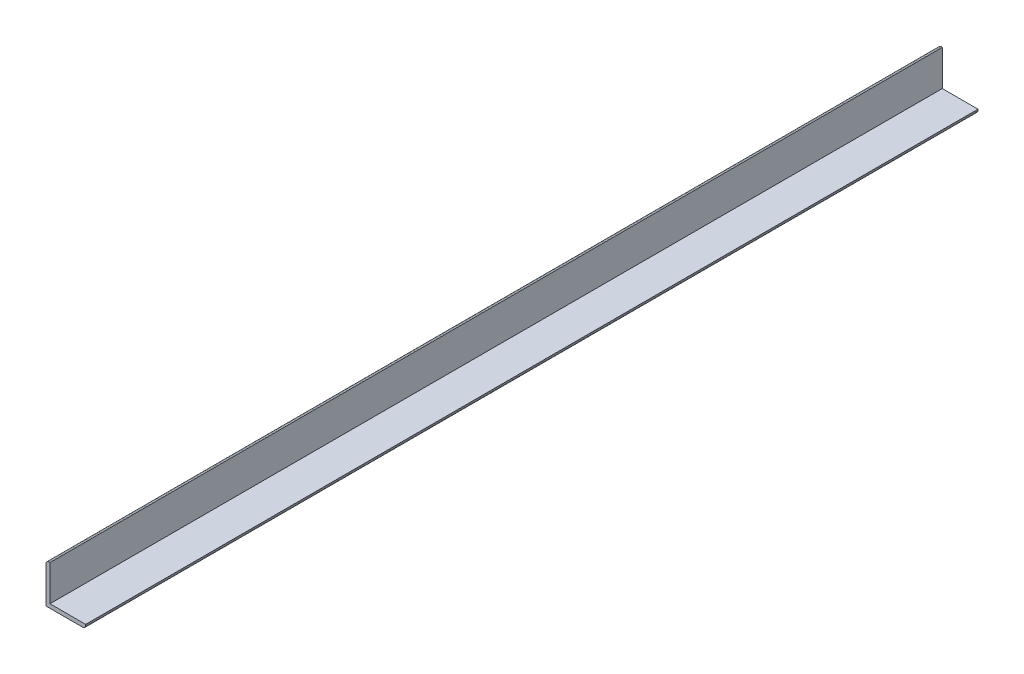
ISO-10303-21;
HEADER;
FILE_DESCRIPTION(('STEP AP214'),'2;1');
FILE_NAME('part.step','',(''),(''),'','','');
FILE_SCHEMA(('AUTOMOTIVE_DESIGN { 1 0 10303 214 1 1 1 1 }'));
ENDSEC;
DATA;
#1=APPLICATION_CONTEXT('core data for automotive mechanical design processes');
#2=APPLICATION_PROTOCOL_DEFINITION('international standard','automotive_design',2000,#1);
#3=PRODUCT_CONTEXT('',#1,'mechanical');
#4=PRODUCT('Part','Part','',(#3));
#5=PRODUCT_RELATED_PRODUCT_CATEGORY('part','',(#4));
#6=PRODUCT_DEFINITION_FORMATION('','',#4);
#7=PRODUCT_DEFINITION_CONTEXT('part definition',#1,'design');
#8=PRODUCT_DEFINITION('design','',#6,#7);
#9=PRODUCT_DEFINITION_SHAPE('','',#8);
#10=(LENGTH_UNIT() NAMED_UNIT(*) SI_UNIT(.MILLI.,.METRE.));
#11=(NAMED_UNIT(*) PLANE_ANGLE_UNIT() SI_UNIT($,.RADIAN.));
#12=(NAMED_UNIT(*) SI_UNIT($,.STERADIAN.) SOLID_ANGLE_UNIT());
#13=UNCERTAINTY_MEASURE_WITH_UNIT(LENGTH_MEASURE(1.E-05),#10,'distance_accuracy_value','');
#14=(GEOMETRIC_REPRESENTATION_CONTEXT(3) GLOBAL_UNCERTAINTY_ASSIGNED_CONTEXT((#13)) GLOBAL_UNIT_ASSIGNED_CONTEXT((#10,
#11,#12)) REPRESENTATION_CONTEXT('',''));
#15=CARTESIAN_POINT('',(0.,0.,0.));
#16=DIRECTION('',(0.,0.,1.));
#17=DIRECTION('',(1.,0.,0.));
#18=AXIS2_PLACEMENT_3D('',#15,#16,#17);
#19=CARTESIAN_POINT('',(0.,36.9999999999999,956.568542494924));
#20=DIRECTION('',(1.,0.,0.));
#21=DIRECTION('',(0.,1.,0.));
#22=AXIS2_PLACEMENT_3D('',#19,#20,#21);
#23=PLANE('',#22);
#24=DIRECTION('',(0.,-1.,0.));
#25=VECTOR('',#24,1.);
#26=CARTESIAN_POINT('',(0.,36.9999999999999,900.000000000001));
#27=LINE('',#26,#25);
#28=CARTESIAN_POINT('',(0.,36.9999999999999,900.000000000001));
#29=VERTEX_POINT('',#28);
#30=CARTESIAN_POINT('',(0.,0.,900.000000000001));
#31=VERTEX_POINT('',#30);
#32=EDGE_CURVE('E134',#29,#31,#27,.T.);
#33=ORIENTED_EDGE('',*,*,#32,.F.);
#34=DIRECTION('',(0.,0.,-1.));
#35=VECTOR('',#34,1.);
#36=CARTESIAN_POINT('',(0.,36.9999999999999,956.568542494924));
#37=LINE('',#36,#35);
#38=CARTESIAN_POINT('',(0.,37.,0.));
#39=VERTEX_POINT('',#38);
#40=EDGE_CURVE('E39',#29,#39,#37,.T.);
#41=ORIENTED_EDGE('',*,*,#40,.T.);
#42=DIRECTION('',(0.,-1.,0.));
#43=VECTOR('',#42,1.);
#44=CARTESIAN_POINT('',(0.,37.,0.));
#45=LINE('',#44,#43);
#46=CARTESIAN_POINT('',(0.,0.,0.));
#47=VERTEX_POINT('',#46);
#48=EDGE_CURVE('E142',#39,#47,#45,.T.);
#49=ORIENTED_EDGE('',*,*,#48,.T.);
#50=DIRECTION('',(0.,0.,-1.));
#51=VECTOR('',#50,1.);
#52=CARTESIAN_POINT('',(0.,-1.06200442050999E-13,956.568542494924));
#53=LINE('',#52,#51);
#54=EDGE_CURVE('E90',#31,#47,#53,.T.);
#55=ORIENTED_EDGE('',*,*,#54,.F.);
#56=EDGE_LOOP('',(#33,#41,#49,#55));
#57=FACE_BOUND('',#56,.T.);
#58=ADVANCED_FACE('F35',(#57),#23,.F.);
#59=CARTESIAN_POINT('',(0.,-1.06200442050999E-13,956.568542494924));
#60=DIRECTION('',(0.,1.,0.));
#61=DIRECTION('',(0.,0.,1.));
#62=AXIS2_PLACEMENT_3D('',#59,#60,#61);
#63=PLANE('',#62);
#64=DIRECTION('',(1.,0.,0.));
#65=VECTOR('',#64,1.);
#66=CARTESIAN_POINT('',(0.,0.,900.000000000001));
#67=LINE('',#66,#65);
#68=CARTESIAN_POINT('',(37.,0.,900.000000000001));
#69=VERTEX_POINT('',#68);
#70=EDGE_CURVE('E97',#31,#69,#67,.T.);
#71=ORIENTED_EDGE('',*,*,#70,.F.);
#72=ORIENTED_EDGE('',*,*,#54,.T.);
#73=DIRECTION('',(1.,0.,0.));
#74=VECTOR('',#73,1.);
#75=CARTESIAN_POINT('',(0.,0.,0.));
#76=LINE('',#75,#74);
#77=CARTESIAN_POINT('',(37.,0.,0.));
#78=VERTEX_POINT('',#77);
#79=EDGE_CURVE('E141',#47,#78,#76,.T.);
#80=ORIENTED_EDGE('',*,*,#79,.T.);
#81=DIRECTION('',(0.,0.,-1.));
#82=VECTOR('',#81,1.);
#83=CARTESIAN_POINT('',(37.,-1.06200442050999E-13,956.568542494924));
#84=LINE('',#83,#82);
#85=EDGE_CURVE('E143',#69,#78,#84,.T.);
#86=ORIENTED_EDGE('',*,*,#85,.F.);
#87=EDGE_LOOP('',(#71,#72,#80,#86));
#88=FACE_BOUND('',#87,.T.);
#89=ADVANCED_FACE('F172',(#88),#63,.F.);
#90=CARTESIAN_POINT('',(37.,2.99999999999989,956.568542494924));
#91=DIRECTION('',(0.,0.,-1.));
#92=DIRECTION('',(0.,1.,0.));
#93=AXIS2_PLACEMENT_3D('',#90,#91,#92);
#94=CYLINDRICAL_SURFACE('',#93,3.);
#95=CARTESIAN_POINT('',(37.,2.9999999999999,900.000000000001));
#96=DIRECTION('',(0.,0.,1.));
#97=DIRECTION('',(1.,0.,0.));
#98=AXIS2_PLACEMENT_3D('',#95,#96,#97);
#99=CIRCLE('',#98,3.);
#100=CARTESIAN_POINT('',(40.,2.99999999999992,900.000000000001));
#101=VERTEX_POINT('',#100);
#102=EDGE_CURVE('E130',#69,#101,#99,.T.);
#103=ORIENTED_EDGE('',*,*,#102,.F.);
#104=ORIENTED_EDGE('',*,*,#85,.T.);
#105=CARTESIAN_POINT('',(37.,3.,0.));
#106=DIRECTION('',(0.,0.,1.));
#107=DIRECTION('',(1.,0.,0.));
#108=AXIS2_PLACEMENT_3D('',#105,#106,#107);
#109=CIRCLE('',#108,3.);
#110=CARTESIAN_POINT('',(40.,3.00000000000002,0.));
#111=VERTEX_POINT('',#110);
#112=EDGE_CURVE('E145',#78,#111,#109,.T.);
#113=ORIENTED_EDGE('',*,*,#112,.T.);
#114=DIRECTION('',(0.,0.,-1.));
#115=VECTOR('',#114,1.);
#116=CARTESIAN_POINT('',(40.,2.99999999999992,956.568542494924));
#117=LINE('',#116,#115);
#118=EDGE_CURVE('E146',#101,#111,#117,.T.);
#119=ORIENTED_EDGE('',*,*,#118,.F.);
#120=EDGE_LOOP('',(#103,#104,#113,#119));
#121=FACE_BOUND('',#120,.T.);
#122=ADVANCED_FACE('F175',(#121),#94,.T.);
#123=CARTESIAN_POINT('',(40.,2.99999999999992,956.568542494924));
#124=DIRECTION('',(-1.,0.,0.));
#125=DIRECTION('',(0.,0.,1.));
#126=AXIS2_PLACEMENT_3D('',#123,#124,#125);
#127=PLANE('',#126);
#128=DIRECTION('',(0.,1.,0.));
#129=VECTOR('',#128,1.);
#130=CARTESIAN_POINT('',(40.,2.99999999999992,900.000000000001));
#131=LINE('',#130,#129);
#132=CARTESIAN_POINT('',(40.,3.9999999999999,900.000000000001));
#133=VERTEX_POINT('',#132);
#134=EDGE_CURVE('E125',#101,#133,#131,.T.);
#135=ORIENTED_EDGE('',*,*,#134,.F.);
#136=ORIENTED_EDGE('',*,*,#118,.T.);
#137=DIRECTION('',(0.,1.,0.));
#138=VECTOR('',#137,1.);
#139=CARTESIAN_POINT('',(40.,3.00000000000002,0.));
#140=LINE('',#139,#138);
#141=CARTESIAN_POINT('',(40.,4.,0.));
#142=VERTEX_POINT('',#141);
#143=EDGE_CURVE('E148',#111,#142,#140,.T.);
#144=ORIENTED_EDGE('',*,*,#143,.T.);
#145=DIRECTION('',(0.,0.,-1.));
#146=VECTOR('',#145,1.);
#147=CARTESIAN_POINT('',(40.,3.99999999999989,956.568542494924));
#148=LINE('',#147,#146);
#149=EDGE_CURVE('E149',#133,#142,#148,.T.);
#150=ORIENTED_EDGE('',*,*,#149,.F.);
#151=EDGE_LOOP('',(#135,#136,#144,#150));
#152=FACE_BOUND('',#151,.T.);
#153=ADVANCED_FACE('F177',(#152),#127,.F.);
#154=CARTESIAN_POINT('',(4.,3.99999999999989,956.568542494924));
#155=DIRECTION('',(0.,-1.,0.));
#156=DIRECTION('',(1.,0.,0.));
#157=AXIS2_PLACEMENT_3D('',#154,#155,#156);
#158=PLANE('',#157);
#159=DIRECTION('',(-1.,0.,0.));
#160=VECTOR('',#159,1.);
#161=CARTESIAN_POINT('',(3.99999999999999,3.9999999999999,900.000000000001));
#162=LINE('',#161,#160);
#163=CARTESIAN_POINT('',(4.,3.9999999999999,900.000000000001));
#164=VERTEX_POINT('',#163);
#165=EDGE_CURVE('E123',#133,#164,#162,.T.);
#166=ORIENTED_EDGE('',*,*,#165,.F.);
#167=ORIENTED_EDGE('',*,*,#149,.T.);
#168=DIRECTION('',(-1.,0.,0.));
#169=VECTOR('',#168,1.);
#170=CARTESIAN_POINT('',(4.,4.,0.));
#171=LINE('',#170,#169);
#172=CARTESIAN_POINT('',(4.,4.,0.));
#173=VERTEX_POINT('',#172);
#174=EDGE_CURVE('E151',#142,#173,#171,.T.);
#175=ORIENTED_EDGE('',*,*,#174,.T.);
#176=DIRECTION('',(0.,0.,-1.));
#177=VECTOR('',#176,1.);
#178=CARTESIAN_POINT('',(4.,3.99999999999989,956.568542494924));
#179=LINE('',#178,#177);
#180=EDGE_CURVE('E152',#164,#173,#179,.T.);
#181=ORIENTED_EDGE('',*,*,#180,.F.);
#182=EDGE_LOOP('',(#166,#167,#175,#181));
#183=FACE_BOUND('',#182,.T.);
#184=ADVANCED_FACE('F181',(#183),#158,.F.);
#185=CARTESIAN_POINT('',(4.,3.99999999999989,956.568542494924));
#186=DIRECTION('',(-1.,0.,0.));
#187=DIRECTION('',(0.,-1.,0.));
#188=AXIS2_PLACEMENT_3D('',#185,#186,#187);
#189=PLANE('',#188);
#190=DIRECTION('',(0.,1.,0.));
#191=VECTOR('',#190,1.);
#192=CARTESIAN_POINT('',(4.,3.99999999999989,900.000000000001));
#193=LINE('',#192,#191);
#194=CARTESIAN_POINT('',(3.99999999999999,39.9999999999999,900.000000000001));
#195=VERTEX_POINT('',#194);
#196=EDGE_CURVE('E44',#164,#195,#193,.T.);
#197=ORIENTED_EDGE('',*,*,#196,.F.);
#198=ORIENTED_EDGE('',*,*,#180,.T.);
#199=DIRECTION('',(0.,1.,0.));
#200=VECTOR('',#199,1.);
#201=CARTESIAN_POINT('',(4.,4.,0.));
#202=LINE('',#201,#200);
#203=CARTESIAN_POINT('',(3.99999999999999,40.,0.));
#204=VERTEX_POINT('',#203);
#205=EDGE_CURVE('E117',#173,#204,#202,.T.);
#206=ORIENTED_EDGE('',*,*,#205,.T.);
#207=DIRECTION('',(0.,0.,-1.));
#208=VECTOR('',#207,1.);
#209=CARTESIAN_POINT('',(3.99999999999999,39.9999999999999,956.568542494924));
#210=LINE('',#209,#208);
#211=EDGE_CURVE('E108',#195,#204,#210,.T.);
#212=ORIENTED_EDGE('',*,*,#211,.F.);
#213=EDGE_LOOP('',(#197,#198,#206,#212));
#214=FACE_BOUND('',#213,.T.);
#215=ADVANCED_FACE('F114',(#214),#189,.F.);
#216=CARTESIAN_POINT('',(3.99999999999999,39.9999999999999,956.568542494924));
#217=DIRECTION('',(0.,-1.,0.));
#218=DIRECTION('',(0.,0.,-1.));
#219=AXIS2_PLACEMENT_3D('',#216,#217,#218);
#220=PLANE('',#219);
#221=DIRECTION('',(-1.,0.,0.));
#222=VECTOR('',#221,1.);
#223=CARTESIAN_POINT('',(3.99999999999998,39.9999999999999,900.000000000001));
#224=LINE('',#223,#222);
#225=CARTESIAN_POINT('',(3.00000000000001,39.9999999999999,900.000000000001));
#226=VERTEX_POINT('',#225);
#227=EDGE_CURVE('E11',#195,#226,#224,.T.);
#228=ORIENTED_EDGE('',*,*,#227,.F.);
#229=ORIENTED_EDGE('',*,*,#211,.T.);
#230=DIRECTION('',(-1.,0.,0.));
#231=VECTOR('',#230,1.);
#232=CARTESIAN_POINT('',(3.99999999999999,40.,0.));
#233=LINE('',#232,#231);
#234=CARTESIAN_POINT('',(3.00000000000001,40.,0.));
#235=VERTEX_POINT('',#234);
#236=EDGE_CURVE('E119',#204,#235,#233,.T.);
#237=ORIENTED_EDGE('',*,*,#236,.T.);
#238=DIRECTION('',(0.,0.,-1.));
#239=VECTOR('',#238,1.);
#240=CARTESIAN_POINT('',(3.00000000000001,39.9999999999999,956.568542494924));
#241=LINE('',#240,#239);
#242=EDGE_CURVE('E57',#226,#235,#241,.T.);
#243=ORIENTED_EDGE('',*,*,#242,.F.);
#244=EDGE_LOOP('',(#228,#229,#237,#243));
#245=FACE_BOUND('',#244,.T.);
#246=ADVANCED_FACE('F107',(#245),#220,.F.);
#247=CARTESIAN_POINT('',(2.99999999999999,36.9999999999999,956.568542494924));
#248=DIRECTION('',(0.,0.,-1.));
#249=DIRECTION('',(0.,1.,0.));
#250=AXIS2_PLACEMENT_3D('',#247,#248,#249);
#251=CYLINDRICAL_SURFACE('',#250,3.);
#252=CARTESIAN_POINT('',(2.99999999999999,36.9999999999999,900.000000000001));
#253=DIRECTION('',(0.,0.,1.));
#254=DIRECTION('',(1.,0.,0.));
#255=AXIS2_PLACEMENT_3D('',#252,#253,#254);
#256=CIRCLE('',#255,3.);
#257=EDGE_CURVE('E137',#226,#29,#256,.T.);
#258=ORIENTED_EDGE('',*,*,#257,.F.);
#259=ORIENTED_EDGE('',*,*,#242,.T.);
#260=CARTESIAN_POINT('',(2.99999999999999,37.,0.));
#261=DIRECTION('',(0.,0.,1.));
#262=DIRECTION('',(1.,0.,0.));
#263=AXIS2_PLACEMENT_3D('',#260,#261,#262);
#264=CIRCLE('',#263,3.);
#265=EDGE_CURVE('E139',#235,#39,#264,.T.);
#266=ORIENTED_EDGE('',*,*,#265,.T.);
#267=ORIENTED_EDGE('',*,*,#40,.F.);
#268=EDGE_LOOP('',(#258,#259,#266,#267));
#269=FACE_BOUND('',#268,.T.);
#270=ADVANCED_FACE('F167',(#269),#251,.T.);
#271=CARTESIAN_POINT('',(37.,3.,0.));
#272=DIRECTION('',(0.,0.,1.));
#273=DIRECTION('',(1.,0.,0.));
#274=AXIS2_PLACEMENT_3D('',#271,#272,#273);
#275=PLANE('',#274);
#276=ORIENTED_EDGE('',*,*,#48,.F.);
#277=ORIENTED_EDGE('',*,*,#265,.F.);
#278=ORIENTED_EDGE('',*,*,#236,.F.);
#279=ORIENTED_EDGE('',*,*,#205,.F.);
#280=ORIENTED_EDGE('',*,*,#174,.F.);
#281=ORIENTED_EDGE('',*,*,#143,.F.);
#282=ORIENTED_EDGE('',*,*,#112,.F.);
#283=ORIENTED_EDGE('',*,*,#79,.F.);
#284=EDGE_LOOP('',(#276,#277,#278,#279,#280,#281,#282,#283));
#285=FACE_BOUND('',#284,.T.);
#286=ADVANCED_FACE('F169',(#285),#275,.F.);
#287=CARTESIAN_POINT('',(-1996.,-4081.001,900.000000000001));
#288=DIRECTION('',(0.,0.,1.));
#289=DIRECTION('',(1.,0.,0.));
#290=AXIS2_PLACEMENT_3D('',#287,#288,#289);
#291=PLANE('',#290);
#292=ORIENTED_EDGE('',*,*,#257,.T.);
#293=ORIENTED_EDGE('',*,*,#32,.T.);
#294=ORIENTED_EDGE('',*,*,#70,.T.);
#295=ORIENTED_EDGE('',*,*,#102,.T.);
#296=ORIENTED_EDGE('',*,*,#134,.T.);
#297=ORIENTED_EDGE('',*,*,#165,.T.);
#298=ORIENTED_EDGE('',*,*,#196,.T.);
#299=ORIENTED_EDGE('',*,*,#227,.T.);
#300=EDGE_LOOP('',(#292,#293,#294,#295,#296,#297,#298,#299));
#301=FACE_BOUND('',#300,.T.);
#302=ADVANCED_FACE('F37',(#301),#291,.T.);
#303=CLOSED_SHELL('',(#58,#89,#122,#153,#184,#215,#246,#270,#286,#302));
#304=MANIFOLD_SOLID_BREP('B2',#303);
#305=ADVANCED_BREP_SHAPE_REPRESENTATION('',(#18,#304),#14);
#306=SHAPE_DEFINITION_REPRESENTATION(#9,#305);
ENDSEC;
END-ISO-10303-21;
